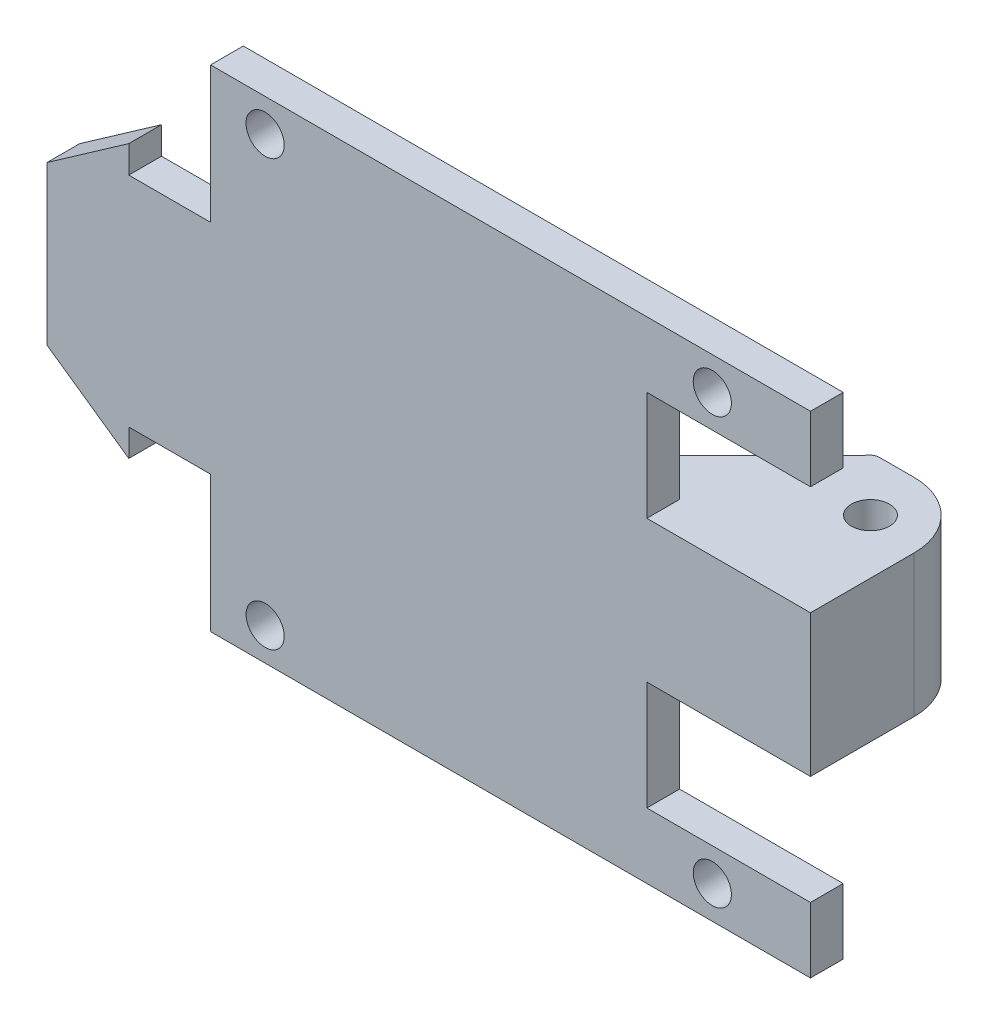
ISO-10303-21;
HEADER;
FILE_DESCRIPTION(('STEP AP214'),'2;1');
FILE_NAME('part.step','',(''),(''),'','','');
FILE_SCHEMA(('AUTOMOTIVE_DESIGN { 1 0 10303 214 1 1 1 1 }'));
ENDSEC;
DATA;
#1=APPLICATION_CONTEXT('core data for automotive mechanical design processes');
#2=APPLICATION_PROTOCOL_DEFINITION('international standard','automotive_design',2000,#1);
#3=PRODUCT_CONTEXT('',#1,'mechanical');
#4=PRODUCT('Part','Part','',(#3));
#5=PRODUCT_RELATED_PRODUCT_CATEGORY('part','',(#4));
#6=PRODUCT_DEFINITION_FORMATION('','',#4);
#7=PRODUCT_DEFINITION_CONTEXT('part definition',#1,'design');
#8=PRODUCT_DEFINITION('design','',#6,#7);
#9=PRODUCT_DEFINITION_SHAPE('','',#8);
#10=(LENGTH_UNIT() NAMED_UNIT(*) SI_UNIT(.MILLI.,.METRE.));
#11=(NAMED_UNIT(*) PLANE_ANGLE_UNIT() SI_UNIT($,.RADIAN.));
#12=(NAMED_UNIT(*) SI_UNIT($,.STERADIAN.) SOLID_ANGLE_UNIT());
#13=UNCERTAINTY_MEASURE_WITH_UNIT(LENGTH_MEASURE(1.E-05),#10,'distance_accuracy_value','');
#14=(GEOMETRIC_REPRESENTATION_CONTEXT(3) GLOBAL_UNCERTAINTY_ASSIGNED_CONTEXT((#13)) GLOBAL_UNIT_ASSIGNED_CONTEXT((#10,
#11,#12)) REPRESENTATION_CONTEXT('',''));
#15=CARTESIAN_POINT('',(0.,0.,0.));
#16=DIRECTION('',(0.,0.,1.));
#17=DIRECTION('',(1.,0.,0.));
#18=AXIS2_PLACEMENT_3D('',#15,#16,#17);
#19=CARTESIAN_POINT('',(-44.4369973190349,19.343163538874,3.));
#20=DIRECTION('',(1.,0.,0.));
#21=DIRECTION('',(0.,1.,0.));
#22=AXIS2_PLACEMENT_3D('',#19,#20,#21);
#23=PLANE('',#22);
#24=DIRECTION('',(0.,0.,-1.));
#25=VECTOR('',#24,1.);
#26=CARTESIAN_POINT('',(-44.4369973190349,6.843163538874,3.));
#27=LINE('',#26,#25);
#28=CARTESIAN_POINT('',(-44.4369973190349,6.843163538874,3.));
#29=VERTEX_POINT('',#28);
#30=CARTESIAN_POINT('',(-44.4369973190349,6.843163538874,0.));
#31=VERTEX_POINT('',#30);
#32=EDGE_CURVE('E217',#29,#31,#27,.T.);
#33=ORIENTED_EDGE('',*,*,#32,.F.);
#34=DIRECTION('',(0.,-1.,0.));
#35=VECTOR('',#34,1.);
#36=CARTESIAN_POINT('',(-44.4369973190349,19.343163538874,3.));
#37=LINE('',#36,#35);
#38=CARTESIAN_POINT('',(-44.4369973190349,19.343163538874,3.));
#39=VERTEX_POINT('',#38);
#40=EDGE_CURVE('E204',#39,#29,#37,.T.);
#41=ORIENTED_EDGE('',*,*,#40,.F.);
#42=DIRECTION('',(0.,0.,-1.));
#43=VECTOR('',#42,1.);
#44=CARTESIAN_POINT('',(-44.4369973190349,19.343163538874,3.));
#45=LINE('',#44,#43);
#46=CARTESIAN_POINT('',(-44.4369973190349,19.343163538874,0.));
#47=VERTEX_POINT('',#46);
#48=EDGE_CURVE('E329',#39,#47,#45,.T.);
#49=ORIENTED_EDGE('',*,*,#48,.T.);
#50=DIRECTION('',(0.,-1.,0.));
#51=VECTOR('',#50,1.);
#52=CARTESIAN_POINT('',(-44.4369973190349,19.343163538874,0.));
#53=LINE('',#52,#51);
#54=EDGE_CURVE('E330',#47,#31,#53,.T.);
#55=ORIENTED_EDGE('',*,*,#54,.T.);
#56=EDGE_LOOP('',(#33,#41,#49,#55));
#57=FACE_BOUND('',#56,.T.);
#58=ADVANCED_FACE('F33',(#57),#23,.F.);
#59=CARTESIAN_POINT('',(10.5630026809652,19.343163538874,3.));
#60=DIRECTION('',(-1.,0.,0.));
#61=DIRECTION('',(0.,-1.,0.));
#62=AXIS2_PLACEMENT_3D('',#59,#60,#61);
#63=PLANE('',#62);
#64=DIRECTION('',(0.,0.,-1.));
#65=VECTOR('',#64,1.);
#66=CARTESIAN_POINT('',(10.5630026809652,-19.656836461126,3.));
#67=LINE('',#66,#65);
#68=CARTESIAN_POINT('',(10.5630026809652,-19.656836461126,3.));
#69=VERTEX_POINT('',#68);
#70=CARTESIAN_POINT('',(10.5630026809652,-19.656836461126,0.));
#71=VERTEX_POINT('',#70);
#72=EDGE_CURVE('E284',#69,#71,#67,.T.);
#73=ORIENTED_EDGE('',*,*,#72,.F.);
#74=DIRECTION('',(0.,1.,0.));
#75=VECTOR('',#74,1.);
#76=CARTESIAN_POINT('',(10.5630026809652,19.343163538874,3.));
#77=LINE('',#76,#75);
#78=CARTESIAN_POINT('',(10.5630026809652,-25.656836461126,3.));
#79=VERTEX_POINT('',#78);
#80=EDGE_CURVE('E324',#79,#69,#77,.T.);
#81=ORIENTED_EDGE('',*,*,#80,.F.);
#82=DIRECTION('',(0.,0.,-1.));
#83=VECTOR('',#82,1.);
#84=CARTESIAN_POINT('',(10.5630026809652,-25.656836461126,3.));
#85=LINE('',#84,#83);
#86=CARTESIAN_POINT('',(10.5630026809652,-25.656836461126,0.));
#87=VERTEX_POINT('',#86);
#88=EDGE_CURVE('E346',#79,#87,#85,.T.);
#89=ORIENTED_EDGE('',*,*,#88,.T.);
#90=DIRECTION('',(0.,1.,0.));
#91=VECTOR('',#90,1.);
#92=CARTESIAN_POINT('',(10.5630026809652,19.343163538874,0.));
#93=LINE('',#92,#91);
#94=EDGE_CURVE('E336',#87,#71,#93,.T.);
#95=ORIENTED_EDGE('',*,*,#94,.T.);
#96=EDGE_LOOP('',(#73,#81,#89,#95));
#97=FACE_BOUND('',#96,.T.);
#98=ADVANCED_FACE('F446',(#97),#63,.F.);
#99=CARTESIAN_POINT('',(10.5630026809652,-9.656836461126,3.));
#100=VERTEX_POINT('',#99);
#101=CARTESIAN_POINT('',(10.5630026809652,3.343163538874,3.));
#102=VERTEX_POINT('',#101);
#103=EDGE_CURVE('E327',#100,#102,#77,.T.);
#104=ORIENTED_EDGE('',*,*,#103,.F.);
#105=DIRECTION('',(0.,0.,1.));
#106=VECTOR('',#105,1.);
#107=CARTESIAN_POINT('',(10.5630026809652,-9.656836461126,-12.5));
#108=LINE('',#107,#106);
#109=CARTESIAN_POINT('',(10.5630026809652,-9.656836461126,-6.5));
#110=VERTEX_POINT('',#109);
#111=EDGE_CURVE('E309',#110,#100,#108,.T.);
#112=ORIENTED_EDGE('',*,*,#111,.F.);
#113=DIRECTION('',(0.,-1.,0.));
#114=VECTOR('',#113,1.);
#115=CARTESIAN_POINT('',(10.5630026809652,3.343163538874,-6.5));
#116=LINE('',#115,#114);
#117=CARTESIAN_POINT('',(10.5630026809652,3.343163538874,-6.5));
#118=VERTEX_POINT('',#117);
#119=EDGE_CURVE('E359',#110,#118,#116,.F.);
#120=ORIENTED_EDGE('',*,*,#119,.T.);
#121=DIRECTION('',(0.,0.,1.));
#122=VECTOR('',#121,1.);
#123=CARTESIAN_POINT('',(10.5630026809652,3.343163538874,-12.5));
#124=LINE('',#123,#122);
#125=EDGE_CURVE('E315',#118,#102,#124,.T.);
#126=ORIENTED_EDGE('',*,*,#125,.T.);
#127=EDGE_LOOP('',(#104,#112,#120,#126));
#128=FACE_BOUND('',#127,.T.);
#129=ADVANCED_FACE('F428',(#128),#63,.F.);
#130=CARTESIAN_POINT('',(0.,0.,0.));
#131=DIRECTION('',(0.,0.,1.));
#132=DIRECTION('',(1.,0.,0.));
#133=AXIS2_PLACEMENT_3D('',#130,#131,#132);
#134=PLANE('',#133);
#135=CARTESIAN_POINT('',(1.56300268096516,-22.656836461126,0.));
#136=DIRECTION('',(0.,0.,-1.));
#137=DIRECTION('',(1.,0.,0.));
#138=AXIS2_PLACEMENT_3D('',#135,#136,#137);
#139=CIRCLE('',#138,1.75);
#140=CARTESIAN_POINT('',(3.31300268096516,-22.656836461126,0.));
#141=VERTEX_POINT('',#140);
#142=EDGE_CURVE('E252',#141,#141,#139,.T.);
#143=ORIENTED_EDGE('',*,*,#142,.F.);
#144=EDGE_LOOP('',(#143));
#145=FACE_BOUND('',#144,.T.);
#146=CARTESIAN_POINT('',(-39.4369973190349,16.343163538874,0.));
#147=DIRECTION('',(0.,0.,-1.));
#148=DIRECTION('',(-1.,0.,0.));
#149=AXIS2_PLACEMENT_3D('',#146,#147,#148);
#150=CIRCLE('',#149,1.75);
#151=CARTESIAN_POINT('',(-41.1869973190349,16.343163538874,0.));
#152=VERTEX_POINT('',#151);
#153=EDGE_CURVE('E269',#152,#152,#150,.T.);
#154=ORIENTED_EDGE('',*,*,#153,.F.);
#155=EDGE_LOOP('',(#154));
#156=FACE_BOUND('',#155,.T.);
#157=CARTESIAN_POINT('',(1.56300268096516,16.343163538874,0.));
#158=DIRECTION('',(0.,0.,-1.));
#159=DIRECTION('',(-1.,0.,0.));
#160=AXIS2_PLACEMENT_3D('',#157,#158,#159);
#161=CIRCLE('',#160,1.75);
#162=CARTESIAN_POINT('',(-0.186997319034844,16.343163538874,0.));
#163=VERTEX_POINT('',#162);
#164=EDGE_CURVE('E265',#163,#163,#161,.T.);
#165=ORIENTED_EDGE('',*,*,#164,.F.);
#166=EDGE_LOOP('',(#165));
#167=FACE_BOUND('',#166,.T.);
#168=CARTESIAN_POINT('',(-39.4369973190349,-22.656836461126,0.));
#169=DIRECTION('',(0.,0.,-1.));
#170=DIRECTION('',(1.,0.,0.));
#171=AXIS2_PLACEMENT_3D('',#168,#169,#170);
#172=CIRCLE('',#171,1.75);
#173=CARTESIAN_POINT('',(-37.6869973190349,-22.656836461126,0.));
#174=VERTEX_POINT('',#173);
#175=EDGE_CURVE('E268',#174,#174,#172,.T.);
#176=ORIENTED_EDGE('',*,*,#175,.F.);
#177=EDGE_LOOP('',(#176));
#178=FACE_BOUND('',#177,.T.);
#179=DIRECTION('',(0.,-1.,0.));
#180=VECTOR('',#179,1.);
#181=CARTESIAN_POINT('',(-4.43699731903485,-9.656836461126,0.));
#182=LINE('',#181,#180);
#183=CARTESIAN_POINT('',(-4.43699731903485,-9.656836461126,0.));
#184=VERTEX_POINT('',#183);
#185=CARTESIAN_POINT('',(-4.43699731903485,-19.656836461126,0.));
#186=VERTEX_POINT('',#185);
#187=EDGE_CURVE('E58',#184,#186,#182,.T.);
#188=ORIENTED_EDGE('',*,*,#187,.T.);
#189=DIRECTION('',(1.,0.,0.));
#190=VECTOR('',#189,1.);
#191=CARTESIAN_POINT('',(-4.43699731903485,-19.656836461126,0.));
#192=LINE('',#191,#190);
#193=EDGE_CURVE('E278',#186,#71,#192,.T.);
#194=ORIENTED_EDGE('',*,*,#193,.T.);
#195=ORIENTED_EDGE('',*,*,#94,.F.);
#196=DIRECTION('',(1.,0.,0.));
#197=VECTOR('',#196,1.);
#198=CARTESIAN_POINT('',(-44.4369973190348,-25.656836461126,0.));
#199=LINE('',#198,#197);
#200=CARTESIAN_POINT('',(-44.4369973190348,-25.656836461126,0.));
#201=VERTEX_POINT('',#200);
#202=EDGE_CURVE('E333',#201,#87,#199,.T.);
#203=ORIENTED_EDGE('',*,*,#202,.F.);
#204=CARTESIAN_POINT('',(-44.4369973190348,-13.156836461126,0.));
#205=VERTEX_POINT('',#204);
#206=EDGE_CURVE('E318',#205,#201,#53,.T.);
#207=ORIENTED_EDGE('',*,*,#206,.F.);
#208=DIRECTION('',(-1.,0.,0.));
#209=VECTOR('',#208,1.);
#210=CARTESIAN_POINT('',(-44.4369973190349,-13.156836461126,0.));
#211=LINE('',#210,#209);
#212=CARTESIAN_POINT('',(-51.9369973190349,-13.156836461126,0.));
#213=VERTEX_POINT('',#212);
#214=EDGE_CURVE('E50',#205,#213,#211,.T.);
#215=ORIENTED_EDGE('',*,*,#214,.T.);
#216=DIRECTION('',(0.,-1.,0.));
#217=VECTOR('',#216,1.);
#218=CARTESIAN_POINT('',(-51.9369973190349,-13.156836461126,0.));
#219=LINE('',#218,#217);
#220=CARTESIAN_POINT('',(-51.9369973190349,-15.656836461126,0.));
#221=VERTEX_POINT('',#220);
#222=EDGE_CURVE('E243',#213,#221,#219,.T.);
#223=ORIENTED_EDGE('',*,*,#222,.T.);
#224=DIRECTION('',(-0.819152044288989,0.57357643635105,0.));
#225=VECTOR('',#224,1.);
#226=CARTESIAN_POINT('',(-51.9369973190349,-15.656836461126,0.));
#227=LINE('',#226,#225);
#228=CARTESIAN_POINT('',(-59.4369973190349,-10.4052799245531,0.));
#229=VERTEX_POINT('',#228);
#230=EDGE_CURVE('E246',#221,#229,#227,.T.);
#231=ORIENTED_EDGE('',*,*,#230,.T.);
#232=DIRECTION('',(0.,-1.,0.));
#233=VECTOR('',#232,1.);
#234=CARTESIAN_POINT('',(-59.4369973190349,4.09160700230121,0.));
#235=LINE('',#234,#233);
#236=CARTESIAN_POINT('',(-59.4369973190349,4.09160700230121,0.));
#237=VERTEX_POINT('',#236);
#238=EDGE_CURVE('E225',#237,#229,#235,.T.);
#239=ORIENTED_EDGE('',*,*,#238,.F.);
#240=DIRECTION('',(-0.819152044288993,-0.573576436351044,0.));
#241=VECTOR('',#240,1.);
#242=CARTESIAN_POINT('',(-51.9369973190349,9.343163538874,0.));
#243=LINE('',#242,#241);
#244=CARTESIAN_POINT('',(-51.9369973190349,9.343163538874,0.));
#245=VERTEX_POINT('',#244);
#246=EDGE_CURVE('E223',#245,#237,#243,.T.);
#247=ORIENTED_EDGE('',*,*,#246,.F.);
#248=DIRECTION('',(0.,-1.,0.));
#249=VECTOR('',#248,1.);
#250=CARTESIAN_POINT('',(-51.9369973190349,9.343163538874,0.));
#251=LINE('',#250,#249);
#252=CARTESIAN_POINT('',(-51.9369973190349,6.843163538874,0.));
#253=VERTEX_POINT('',#252);
#254=EDGE_CURVE('E239',#245,#253,#251,.T.);
#255=ORIENTED_EDGE('',*,*,#254,.T.);
#256=DIRECTION('',(-1.,0.,0.));
#257=VECTOR('',#256,1.);
#258=CARTESIAN_POINT('',(-44.4369973190349,6.843163538874,0.));
#259=LINE('',#258,#257);
#260=EDGE_CURVE('E213',#31,#253,#259,.T.);
#261=ORIENTED_EDGE('',*,*,#260,.F.);
#262=ORIENTED_EDGE('',*,*,#54,.F.);
#263=DIRECTION('',(-1.,0.,0.));
#264=VECTOR('',#263,1.);
#265=CARTESIAN_POINT('',(-44.4369973190349,19.343163538874,0.));
#266=LINE('',#265,#264);
#267=CARTESIAN_POINT('',(10.5630026809652,19.343163538874,0.));
#268=VERTEX_POINT('',#267);
#269=EDGE_CURVE('E339',#268,#47,#266,.T.);
#270=ORIENTED_EDGE('',*,*,#269,.F.);
#271=CARTESIAN_POINT('',(10.5630026809652,13.343163538874,0.));
#272=VERTEX_POINT('',#271);
#273=EDGE_CURVE('E335',#272,#268,#93,.T.);
#274=ORIENTED_EDGE('',*,*,#273,.F.);
#275=DIRECTION('',(1.,0.,0.));
#276=VECTOR('',#275,1.);
#277=CARTESIAN_POINT('',(-4.43699731903485,13.343163538874,0.));
#278=LINE('',#277,#276);
#279=CARTESIAN_POINT('',(-4.43699731903485,13.343163538874,0.));
#280=VERTEX_POINT('',#279);
#281=EDGE_CURVE('E290',#280,#272,#278,.T.);
#282=ORIENTED_EDGE('',*,*,#281,.F.);
#283=DIRECTION('',(0.,1.,0.));
#284=VECTOR('',#283,1.);
#285=CARTESIAN_POINT('',(-4.43699731903484,3.343163538874,0.));
#286=LINE('',#285,#284);
#287=CARTESIAN_POINT('',(-4.43699731903484,3.343163538874,0.));
#288=VERTEX_POINT('',#287);
#289=EDGE_CURVE('E287',#288,#280,#286,.T.);
#290=ORIENTED_EDGE('',*,*,#289,.F.);
#291=DIRECTION('',(1.,0.,0.));
#292=VECTOR('',#291,1.);
#293=CARTESIAN_POINT('',(0.563002680965156,3.343163538874,0.));
#294=LINE('',#293,#292);
#295=CARTESIAN_POINT('',(-11.4369973190348,3.343163538874,0.));
#296=VERTEX_POINT('',#295);
#297=EDGE_CURVE('E310',#296,#288,#294,.T.);
#298=ORIENTED_EDGE('',*,*,#297,.F.);
#299=DIRECTION('',(0.,-1.,0.));
#300=VECTOR('',#299,1.);
#301=CARTESIAN_POINT('',(-11.4369973190348,-9.656836461126,0.));
#302=LINE('',#301,#300);
#303=CARTESIAN_POINT('',(-11.4369973190348,-9.65683646112599,0.));
#304=VERTEX_POINT('',#303);
#305=EDGE_CURVE('E367',#296,#304,#302,.T.);
#306=ORIENTED_EDGE('',*,*,#305,.T.);
#307=DIRECTION('',(-1.,0.,0.));
#308=VECTOR('',#307,1.);
#309=CARTESIAN_POINT('',(0.563002680965156,-9.656836461126,0.));
#310=LINE('',#309,#308);
#311=EDGE_CURVE('E306',#184,#304,#310,.T.);
#312=ORIENTED_EDGE('',*,*,#311,.F.);
#313=EDGE_LOOP('',(#188,#194,#195,#203,#207,#215,#223,#231,#239,#247,#255,#261,#262,#270,#274,
#282,#290,#298,#306,#312));
#314=FACE_BOUND('',#313,.T.);
#315=ADVANCED_FACE('F411',(#145,#156,#167,#178,#314),#134,.F.);
#316=CARTESIAN_POINT('',(0.,0.,3.));
#317=DIRECTION('',(0.,0.,1.));
#318=DIRECTION('',(1.,0.,0.));
#319=AXIS2_PLACEMENT_3D('',#316,#317,#318);
#320=PLANE('',#319);
#321=CARTESIAN_POINT('',(1.56300268096516,-22.656836461126,3.));
#322=DIRECTION('',(0.,0.,1.));
#323=DIRECTION('',(1.,0.,0.));
#324=AXIS2_PLACEMENT_3D('',#321,#322,#323);
#325=CIRCLE('',#324,1.75);
#326=CARTESIAN_POINT('',(3.31300268096516,-22.656836461126,3.));
#327=VERTEX_POINT('',#326);
#328=EDGE_CURVE('E37',#327,#327,#325,.T.);
#329=ORIENTED_EDGE('',*,*,#328,.F.);
#330=EDGE_LOOP('',(#329));
#331=FACE_BOUND('',#330,.T.);
#332=CARTESIAN_POINT('',(-39.4369973190349,16.343163538874,3.));
#333=DIRECTION('',(0.,0.,1.));
#334=DIRECTION('',(1.,0.,0.));
#335=AXIS2_PLACEMENT_3D('',#332,#333,#334);
#336=CIRCLE('',#335,1.75);
#337=CARTESIAN_POINT('',(-37.6869973190349,16.343163538874,3.));
#338=VERTEX_POINT('',#337);
#339=EDGE_CURVE('E398',#338,#338,#336,.T.);
#340=ORIENTED_EDGE('',*,*,#339,.F.);
#341=EDGE_LOOP('',(#340));
#342=FACE_BOUND('',#341,.T.);
#343=CARTESIAN_POINT('',(1.56300268096516,16.343163538874,3.));
#344=DIRECTION('',(0.,0.,1.));
#345=DIRECTION('',(1.,0.,0.));
#346=AXIS2_PLACEMENT_3D('',#343,#344,#345);
#347=CIRCLE('',#346,1.75);
#348=CARTESIAN_POINT('',(3.31300268096516,16.343163538874,3.));
#349=VERTEX_POINT('',#348);
#350=EDGE_CURVE('E396',#349,#349,#347,.T.);
#351=ORIENTED_EDGE('',*,*,#350,.F.);
#352=EDGE_LOOP('',(#351));
#353=FACE_BOUND('',#352,.T.);
#354=CARTESIAN_POINT('',(-39.4369973190349,-22.656836461126,3.));
#355=DIRECTION('',(0.,0.,1.));
#356=DIRECTION('',(1.,0.,0.));
#357=AXIS2_PLACEMENT_3D('',#354,#355,#356);
#358=CIRCLE('',#357,1.75);
#359=CARTESIAN_POINT('',(-37.6869973190349,-22.656836461126,3.));
#360=VERTEX_POINT('',#359);
#361=EDGE_CURVE('E276',#360,#360,#358,.T.);
#362=ORIENTED_EDGE('',*,*,#361,.F.);
#363=EDGE_LOOP('',(#362));
#364=FACE_BOUND('',#363,.T.);
#365=ORIENTED_EDGE('',*,*,#80,.T.);
#366=DIRECTION('',(-1.,0.,0.));
#367=VECTOR('',#366,1.);
#368=CARTESIAN_POINT('',(0.,-19.656836461126,3.));
#369=LINE('',#368,#367);
#370=CARTESIAN_POINT('',(-4.43699731903485,-19.656836461126,3.));
#371=VERTEX_POINT('',#370);
#372=EDGE_CURVE('E11',#69,#371,#369,.T.);
#373=ORIENTED_EDGE('',*,*,#372,.T.);
#374=DIRECTION('',(0.,1.,0.));
#375=VECTOR('',#374,1.);
#376=CARTESIAN_POINT('',(-4.43699731903484,0.,3.));
#377=LINE('',#376,#375);
#378=CARTESIAN_POINT('',(-4.43699731903485,-9.656836461126,3.));
#379=VERTEX_POINT('',#378);
#380=EDGE_CURVE('E42',#371,#379,#377,.T.);
#381=ORIENTED_EDGE('',*,*,#380,.T.);
#382=DIRECTION('',(1.,0.,0.));
#383=VECTOR('',#382,1.);
#384=CARTESIAN_POINT('',(0.,-9.656836461126,3.));
#385=LINE('',#384,#383);
#386=EDGE_CURVE('E389',#379,#100,#385,.T.);
#387=ORIENTED_EDGE('',*,*,#386,.T.);
#388=ORIENTED_EDGE('',*,*,#103,.T.);
#389=DIRECTION('',(1.,0.,0.));
#390=VECTOR('',#389,1.);
#391=CARTESIAN_POINT('',(0.,3.343163538874,3.));
#392=LINE('',#391,#390);
#393=CARTESIAN_POINT('',(-4.43699731903484,3.343163538874,3.));
#394=VERTEX_POINT('',#393);
#395=EDGE_CURVE('E386',#394,#102,#392,.T.);
#396=ORIENTED_EDGE('',*,*,#395,.F.);
#397=DIRECTION('',(0.,-1.,0.));
#398=VECTOR('',#397,1.);
#399=CARTESIAN_POINT('',(-4.43699731903484,0.,3.));
#400=LINE('',#399,#398);
#401=CARTESIAN_POINT('',(-4.43699731903485,13.343163538874,3.));
#402=VERTEX_POINT('',#401);
#403=EDGE_CURVE('E384',#402,#394,#400,.T.);
#404=ORIENTED_EDGE('',*,*,#403,.F.);
#405=DIRECTION('',(-1.,0.,0.));
#406=VECTOR('',#405,1.);
#407=CARTESIAN_POINT('',(0.,13.343163538874,3.));
#408=LINE('',#407,#406);
#409=CARTESIAN_POINT('',(10.5630026809652,13.343163538874,3.));
#410=VERTEX_POINT('',#409);
#411=EDGE_CURVE('E382',#410,#402,#408,.T.);
#412=ORIENTED_EDGE('',*,*,#411,.F.);
#413=CARTESIAN_POINT('',(10.5630026809652,19.343163538874,3.));
#414=VERTEX_POINT('',#413);
#415=EDGE_CURVE('E323',#410,#414,#77,.T.);
#416=ORIENTED_EDGE('',*,*,#415,.T.);
#417=DIRECTION('',(-1.,0.,0.));
#418=VECTOR('',#417,1.);
#419=CARTESIAN_POINT('',(-44.4369973190349,19.343163538874,3.));
#420=LINE('',#419,#418);
#421=EDGE_CURVE('E326',#414,#39,#420,.T.);
#422=ORIENTED_EDGE('',*,*,#421,.T.);
#423=ORIENTED_EDGE('',*,*,#40,.T.);
#424=DIRECTION('',(-1.,0.,0.));
#425=VECTOR('',#424,1.);
#426=CARTESIAN_POINT('',(-44.4369973190349,6.843163538874,3.));
#427=LINE('',#426,#425);
#428=CARTESIAN_POINT('',(-51.9369973190349,6.843163538874,3.));
#429=VERTEX_POINT('',#428);
#430=EDGE_CURVE('E197',#29,#429,#427,.T.);
#431=ORIENTED_EDGE('',*,*,#430,.T.);
#432=DIRECTION('',(0.,-1.,0.));
#433=VECTOR('',#432,1.);
#434=CARTESIAN_POINT('',(-51.9369973190349,9.343163538874,3.));
#435=LINE('',#434,#433);
#436=CARTESIAN_POINT('',(-51.9369973190349,9.343163538874,3.));
#437=VERTEX_POINT('',#436);
#438=EDGE_CURVE('E202',#437,#429,#435,.T.);
#439=ORIENTED_EDGE('',*,*,#438,.F.);
#440=DIRECTION('',(-0.819152044288993,-0.573576436351044,0.));
#441=VECTOR('',#440,1.);
#442=CARTESIAN_POINT('',(-51.9369973190349,9.343163538874,3.));
#443=LINE('',#442,#441);
#444=CARTESIAN_POINT('',(-59.4369973190349,4.09160700230121,3.));
#445=VERTEX_POINT('',#444);
#446=EDGE_CURVE('E218',#437,#445,#443,.T.);
#447=ORIENTED_EDGE('',*,*,#446,.T.);
#448=DIRECTION('',(0.,-1.,0.));
#449=VECTOR('',#448,1.);
#450=CARTESIAN_POINT('',(-59.4369973190349,4.09160700230121,3.));
#451=LINE('',#450,#449);
#452=CARTESIAN_POINT('',(-59.4369973190349,-10.4052799245531,3.));
#453=VERTEX_POINT('',#452);
#454=EDGE_CURVE('E236',#445,#453,#451,.T.);
#455=ORIENTED_EDGE('',*,*,#454,.T.);
#456=DIRECTION('',(-0.819152044288989,0.57357643635105,0.));
#457=VECTOR('',#456,1.);
#458=CARTESIAN_POINT('',(-51.9369973190349,-15.656836461126,3.));
#459=LINE('',#458,#457);
#460=CARTESIAN_POINT('',(-51.9369973190349,-15.656836461126,3.));
#461=VERTEX_POINT('',#460);
#462=EDGE_CURVE('E233',#461,#453,#459,.T.);
#463=ORIENTED_EDGE('',*,*,#462,.F.);
#464=DIRECTION('',(0.,-1.,0.));
#465=VECTOR('',#464,1.);
#466=CARTESIAN_POINT('',(-51.9369973190349,-13.156836461126,3.));
#467=LINE('',#466,#465);
#468=CARTESIAN_POINT('',(-51.9369973190349,-13.156836461126,3.));
#469=VERTEX_POINT('',#468);
#470=EDGE_CURVE('E230',#469,#461,#467,.T.);
#471=ORIENTED_EDGE('',*,*,#470,.F.);
#472=DIRECTION('',(-1.,0.,0.));
#473=VECTOR('',#472,1.);
#474=CARTESIAN_POINT('',(-44.4369973190349,-13.156836461126,3.));
#475=LINE('',#474,#473);
#476=CARTESIAN_POINT('',(-44.4369973190349,-13.156836461126,3.));
#477=VERTEX_POINT('',#476);
#478=EDGE_CURVE('E207',#477,#469,#475,.T.);
#479=ORIENTED_EDGE('',*,*,#478,.F.);
#480=CARTESIAN_POINT('',(-44.4369973190348,-25.656836461126,3.));
#481=VERTEX_POINT('',#480);
#482=EDGE_CURVE('E321',#477,#481,#37,.T.);
#483=ORIENTED_EDGE('',*,*,#482,.T.);
#484=DIRECTION('',(1.,0.,0.));
#485=VECTOR('',#484,1.);
#486=CARTESIAN_POINT('',(-44.4369973190348,-25.656836461126,3.));
#487=LINE('',#486,#485);
#488=EDGE_CURVE('E320',#481,#79,#487,.T.);
#489=ORIENTED_EDGE('',*,*,#488,.T.);
#490=EDGE_LOOP('',(#365,#373,#381,#387,#388,#396,#404,#412,#416,#422,#423,#431,#439,#447,#455,
#463,#471,#479,#483,#489));
#491=FACE_BOUND('',#490,.T.);
#492=ADVANCED_FACE('F200',(#331,#342,#353,#364,#491),#320,.T.);
#493=ORIENTED_EDGE('',*,*,#482,.F.);
#494=DIRECTION('',(0.,0.,-1.));
#495=VECTOR('',#494,1.);
#496=CARTESIAN_POINT('',(-44.4369973190349,-13.156836461126,3.));
#497=LINE('',#496,#495);
#498=EDGE_CURVE('E262',#477,#205,#497,.T.);
#499=ORIENTED_EDGE('',*,*,#498,.T.);
#500=ORIENTED_EDGE('',*,*,#206,.T.);
#501=DIRECTION('',(0.,0.,-1.));
#502=VECTOR('',#501,1.);
#503=CARTESIAN_POINT('',(-44.4369973190348,-25.656836461126,3.));
#504=LINE('',#503,#502);
#505=EDGE_CURVE('E349',#481,#201,#504,.T.);
#506=ORIENTED_EDGE('',*,*,#505,.F.);
#507=EDGE_LOOP('',(#493,#499,#500,#506));
#508=FACE_BOUND('',#507,.T.);
#509=ADVANCED_FACE('F410',(#508),#23,.F.);
#510=CARTESIAN_POINT('',(-44.4369973190348,-25.656836461126,3.));
#511=DIRECTION('',(0.,1.,0.));
#512=DIRECTION('',(0.,0.,1.));
#513=AXIS2_PLACEMENT_3D('',#510,#511,#512);
#514=PLANE('',#513);
#515=ORIENTED_EDGE('',*,*,#202,.T.);
#516=ORIENTED_EDGE('',*,*,#88,.F.);
#517=ORIENTED_EDGE('',*,*,#488,.F.);
#518=ORIENTED_EDGE('',*,*,#505,.T.);
#519=EDGE_LOOP('',(#515,#516,#517,#518));
#520=FACE_BOUND('',#519,.T.);
#521=ADVANCED_FACE('F453',(#520),#514,.F.);
#522=ORIENTED_EDGE('',*,*,#415,.F.);
#523=DIRECTION('',(0.,0.,-1.));
#524=VECTOR('',#523,1.);
#525=CARTESIAN_POINT('',(10.5630026809652,13.343163538874,3.));
#526=LINE('',#525,#524);
#527=EDGE_CURVE('E295',#410,#272,#526,.T.);
#528=ORIENTED_EDGE('',*,*,#527,.T.);
#529=ORIENTED_EDGE('',*,*,#273,.T.);
#530=DIRECTION('',(0.,0.,-1.));
#531=VECTOR('',#530,1.);
#532=CARTESIAN_POINT('',(10.5630026809652,19.343163538874,3.));
#533=LINE('',#532,#531);
#534=EDGE_CURVE('E343',#414,#268,#533,.T.);
#535=ORIENTED_EDGE('',*,*,#534,.F.);
#536=EDGE_LOOP('',(#522,#528,#529,#535));
#537=FACE_BOUND('',#536,.T.);
#538=ADVANCED_FACE('F488',(#537),#63,.F.);
#539=CARTESIAN_POINT('',(-44.4369973190349,19.343163538874,3.));
#540=DIRECTION('',(0.,-1.,0.));
#541=DIRECTION('',(0.,0.,-1.));
#542=AXIS2_PLACEMENT_3D('',#539,#540,#541);
#543=PLANE('',#542);
#544=ORIENTED_EDGE('',*,*,#269,.T.);
#545=ORIENTED_EDGE('',*,*,#48,.F.);
#546=ORIENTED_EDGE('',*,*,#421,.F.);
#547=ORIENTED_EDGE('',*,*,#534,.T.);
#548=EDGE_LOOP('',(#544,#545,#546,#547));
#549=FACE_BOUND('',#548,.T.);
#550=ADVANCED_FACE('F481',(#549),#543,.F.);
#551=CARTESIAN_POINT('',(0.563002680965156,3.343163538874,-12.5));
#552=DIRECTION('',(0.,-1.,0.));
#553=DIRECTION('',(1.,0.,0.));
#554=AXIS2_PLACEMENT_3D('',#551,#552,#553);
#555=PLANE('',#554);
#556=CARTESIAN_POINT('',(5.56300268096516,3.343163538874,-7.5));
#557=DIRECTION('',(0.,1.,0.));
#558=DIRECTION('',(-1.,0.,0.));
#559=AXIS2_PLACEMENT_3D('',#556,#557,#558);
#560=CIRCLE('',#559,1.75);
#561=CARTESIAN_POINT('',(3.81300268096516,3.343163538874,-7.5));
#562=VERTEX_POINT('',#561);
#563=EDGE_CURVE('E299',#562,#562,#560,.T.);
#564=ORIENTED_EDGE('',*,*,#563,.F.);
#565=EDGE_LOOP('',(#564));
#566=FACE_BOUND('',#565,.T.);
#567=DIRECTION('',(1.,0.,0.));
#568=VECTOR('',#567,1.);
#569=CARTESIAN_POINT('',(0.563002680965156,3.343163538874,-12.5));
#570=LINE('',#569,#568);
#571=CARTESIAN_POINT('',(1.42902808474956,3.343163538874,-12.5));
#572=VERTEX_POINT('',#571);
#573=CARTESIAN_POINT('',(4.56300268096516,3.343163538874,-12.5));
#574=VERTEX_POINT('',#573);
#575=EDGE_CURVE('E303',#572,#574,#570,.T.);
#576=ORIENTED_EDGE('',*,*,#575,.F.);
#577=CARTESIAN_POINT('',(1.42902808474956,3.343163538874,-11.5));
#578=DIRECTION('',(0.,-1.,0.));
#579=DIRECTION('',(1.,0.,0.));
#580=AXIS2_PLACEMENT_3D('',#577,#578,#579);
#581=CIRCLE('',#580,1.);
#582=CARTESIAN_POINT('',(0.563002680965156,3.343163538874,-12.0000000000001));
#583=VERTEX_POINT('',#582);
#584=EDGE_CURVE('E378',#572,#583,#581,.F.);
#585=ORIENTED_EDGE('',*,*,#584,.T.);
#586=DIRECTION('',(0.707106781186544,0.,-0.707106781186551));
#587=VECTOR('',#586,1.);
#588=CARTESIAN_POINT('',(0.813002680965123,3.343163538874,-12.25));
#589=LINE('',#588,#587);
#590=EDGE_CURVE('E370',#583,#296,#589,.F.);
#591=ORIENTED_EDGE('',*,*,#590,.T.);
#592=ORIENTED_EDGE('',*,*,#297,.T.);
#593=DIRECTION('',(0.,0.,-1.));
#594=VECTOR('',#593,1.);
#595=CARTESIAN_POINT('',(-4.43699731903484,3.343163538874,5.));
#596=LINE('',#595,#594);
#597=EDGE_CURVE('E293',#394,#288,#596,.T.);
#598=ORIENTED_EDGE('',*,*,#597,.F.);
#599=ORIENTED_EDGE('',*,*,#395,.T.);
#600=ORIENTED_EDGE('',*,*,#125,.F.);
#601=CARTESIAN_POINT('',(4.56300268096516,3.343163538874,-6.5));
#602=DIRECTION('',(0.,-1.,0.));
#603=DIRECTION('',(1.,0.,0.));
#604=AXIS2_PLACEMENT_3D('',#601,#602,#603);
#605=CIRCLE('',#604,6.);
#606=EDGE_CURVE('E361',#118,#574,#605,.F.);
#607=ORIENTED_EDGE('',*,*,#606,.T.);
#608=EDGE_LOOP('',(#576,#585,#591,#592,#598,#599,#600,#607));
#609=FACE_BOUND('',#608,.T.);
#610=ADVANCED_FACE('F500',(#566,#609),#555,.F.);
#611=CARTESIAN_POINT('',(0.563002680965156,-9.656836461126,-12.5));
#612=DIRECTION('',(0.,1.,0.));
#613=DIRECTION('',(-1.,0.,0.));
#614=AXIS2_PLACEMENT_3D('',#611,#612,#613);
#615=PLANE('',#614);
#616=CARTESIAN_POINT('',(5.56300268096516,-9.656836461126,-7.5));
#617=DIRECTION('',(0.,1.,0.));
#618=DIRECTION('',(-1.,0.,0.));
#619=AXIS2_PLACEMENT_3D('',#616,#617,#618);
#620=CIRCLE('',#619,1.75);
#621=CARTESIAN_POINT('',(3.81300268096516,-9.656836461126,-7.5));
#622=VERTEX_POINT('',#621);
#623=EDGE_CURVE('E302',#622,#622,#620,.T.);
#624=ORIENTED_EDGE('',*,*,#623,.T.);
#625=EDGE_LOOP('',(#624));
#626=FACE_BOUND('',#625,.T.);
#627=DIRECTION('',(-0.707106781186544,0.,0.707106781186551));
#628=VECTOR('',#627,1.);
#629=CARTESIAN_POINT('',(0.813002680965123,-9.656836461126,-12.25));
#630=LINE('',#629,#628);
#631=CARTESIAN_POINT('',(0.563002680965156,-9.656836461126,-12.0000000000001));
#632=VERTEX_POINT('',#631);
#633=EDGE_CURVE('E373',#304,#632,#630,.F.);
#634=ORIENTED_EDGE('',*,*,#633,.T.);
#635=CARTESIAN_POINT('',(1.42902808474956,-9.656836461126,-11.5));
#636=DIRECTION('',(0.,1.,0.));
#637=DIRECTION('',(-1.,0.,0.));
#638=AXIS2_PLACEMENT_3D('',#635,#636,#637);
#639=CIRCLE('',#638,1.);
#640=CARTESIAN_POINT('',(1.42902808474956,-9.656836461126,-12.5));
#641=VERTEX_POINT('',#640);
#642=EDGE_CURVE('E380',#632,#641,#639,.F.);
#643=ORIENTED_EDGE('',*,*,#642,.T.);
#644=DIRECTION('',(-1.,0.,0.));
#645=VECTOR('',#644,1.);
#646=CARTESIAN_POINT('',(0.563002680965156,-9.656836461126,-12.5));
#647=LINE('',#646,#645);
#648=CARTESIAN_POINT('',(4.56300268096516,-9.656836461126,-12.5));
#649=VERTEX_POINT('',#648);
#650=EDGE_CURVE('E305',#649,#641,#647,.T.);
#651=ORIENTED_EDGE('',*,*,#650,.F.);
#652=CARTESIAN_POINT('',(4.56300268096516,-9.656836461126,-6.5));
#653=DIRECTION('',(0.,1.,0.));
#654=DIRECTION('',(-1.,0.,0.));
#655=AXIS2_PLACEMENT_3D('',#652,#653,#654);
#656=CIRCLE('',#655,6.);
#657=EDGE_CURVE('E357',#649,#110,#656,.F.);
#658=ORIENTED_EDGE('',*,*,#657,.T.);
#659=ORIENTED_EDGE('',*,*,#111,.T.);
#660=ORIENTED_EDGE('',*,*,#386,.F.);
#661=DIRECTION('',(0.,0.,-1.));
#662=VECTOR('',#661,1.);
#663=CARTESIAN_POINT('',(-4.43699731903485,-9.656836461126,5.));
#664=LINE('',#663,#662);
#665=EDGE_CURVE('E281',#379,#184,#664,.T.);
#666=ORIENTED_EDGE('',*,*,#665,.T.);
#667=ORIENTED_EDGE('',*,*,#311,.T.);
#668=EDGE_LOOP('',(#634,#643,#651,#658,#659,#660,#666,#667));
#669=FACE_BOUND('',#668,.T.);
#670=ADVANCED_FACE('F437',(#626,#669),#615,.F.);
#671=CARTESIAN_POINT('',(0.,0.,-12.5));
#672=DIRECTION('',(0.,0.,-1.));
#673=DIRECTION('',(-1.,0.,0.));
#674=AXIS2_PLACEMENT_3D('',#671,#672,#673);
#675=PLANE('',#674);
#676=ORIENTED_EDGE('',*,*,#650,.T.);
#677=DIRECTION('',(0.,-1.,0.));
#678=VECTOR('',#677,1.);
#679=CARTESIAN_POINT('',(1.42902808474956,3.343163538874,-12.5));
#680=LINE('',#679,#678);
#681=EDGE_CURVE('E375',#641,#572,#680,.F.);
#682=ORIENTED_EDGE('',*,*,#681,.T.);
#683=ORIENTED_EDGE('',*,*,#575,.T.);
#684=DIRECTION('',(0.,-1.,0.));
#685=VECTOR('',#684,1.);
#686=CARTESIAN_POINT('',(4.56300268096516,-9.656836461126,-12.5));
#687=LINE('',#686,#685);
#688=EDGE_CURVE('E352',#574,#649,#687,.T.);
#689=ORIENTED_EDGE('',*,*,#688,.T.);
#690=EDGE_LOOP('',(#676,#682,#683,#689));
#691=FACE_BOUND('',#690,.T.);
#692=ADVANCED_FACE('F510',(#691),#675,.T.);
#693=CARTESIAN_POINT('',(5.56300268096516,-10.156836461126,-7.5));
#694=DIRECTION('',(0.,1.,0.));
#695=DIRECTION('',(-1.,0.,0.));
#696=AXIS2_PLACEMENT_3D('',#693,#694,#695);
#697=CYLINDRICAL_SURFACE('',#696,1.75);
#698=ORIENTED_EDGE('',*,*,#563,.T.);
#699=EDGE_LOOP('',(#698));
#700=FACE_BOUND('',#699,.T.);
#701=ORIENTED_EDGE('',*,*,#623,.F.);
#702=EDGE_LOOP('',(#701));
#703=FACE_BOUND('',#702,.T.);
#704=ADVANCED_FACE('F570',(#700,#703),#697,.F.);
#705=CARTESIAN_POINT('',(4.56300268096516,0.,-6.5));
#706=DIRECTION('',(0.,1.,0.));
#707=DIRECTION('',(-1.,0.,0.));
#708=AXIS2_PLACEMENT_3D('',#705,#706,#707);
#709=CYLINDRICAL_SURFACE('',#708,6.);
#710=ORIENTED_EDGE('',*,*,#606,.F.);
#711=ORIENTED_EDGE('',*,*,#119,.F.);
#712=ORIENTED_EDGE('',*,*,#657,.F.);
#713=ORIENTED_EDGE('',*,*,#688,.F.);
#714=EDGE_LOOP('',(#710,#711,#712,#713));
#715=FACE_BOUND('',#714,.T.);
#716=ADVANCED_FACE('F514',(#715),#709,.T.);
#717=CARTESIAN_POINT('',(0.563002680965156,-9.656836461126,-12.0000000000001));
#718=DIRECTION('',(-0.707106781186551,0.,-0.707106781186544));
#719=DIRECTION('',(0.,-1.,0.));
#720=AXIS2_PLACEMENT_3D('',#717,#718,#719);
#721=PLANE('',#720);
#722=ORIENTED_EDGE('',*,*,#633,.F.);
#723=ORIENTED_EDGE('',*,*,#305,.F.);
#724=ORIENTED_EDGE('',*,*,#590,.F.);
#725=DIRECTION('',(0.,1.,0.));
#726=VECTOR('',#725,1.);
#727=CARTESIAN_POINT('',(0.563002680965156,3.343163538874,-12.0000000000001));
#728=LINE('',#727,#726);
#729=EDGE_CURVE('E364',#632,#583,#728,.T.);
#730=ORIENTED_EDGE('',*,*,#729,.F.);
#731=EDGE_LOOP('',(#722,#723,#724,#730));
#732=FACE_BOUND('',#731,.T.);
#733=ADVANCED_FACE('F504',(#732),#721,.T.);
#734=CARTESIAN_POINT('',(1.42902808474956,-9.656836461126,-11.5));
#735=DIRECTION('',(0.,1.,0.));
#736=DIRECTION('',(0.,0.,1.));
#737=AXIS2_PLACEMENT_3D('',#734,#735,#736);
#738=CYLINDRICAL_SURFACE('',#737,1.);
#739=ORIENTED_EDGE('',*,*,#642,.F.);
#740=ORIENTED_EDGE('',*,*,#729,.T.);
#741=ORIENTED_EDGE('',*,*,#584,.F.);
#742=ORIENTED_EDGE('',*,*,#681,.F.);
#743=EDGE_LOOP('',(#739,#740,#741,#742));
#744=FACE_BOUND('',#743,.T.);
#745=ADVANCED_FACE('F35',(#744),#738,.T.);
#746=CARTESIAN_POINT('',(-4.43699731903485,13.343163538874,5.));
#747=DIRECTION('',(0.,1.,0.));
#748=DIRECTION('',(-1.,0.,0.));
#749=AXIS2_PLACEMENT_3D('',#746,#747,#748);
#750=PLANE('',#749);
#751=ORIENTED_EDGE('',*,*,#411,.T.);
#752=DIRECTION('',(0.,0.,-1.));
#753=VECTOR('',#752,1.);
#754=CARTESIAN_POINT('',(-4.43699731903485,13.343163538874,5.));
#755=LINE('',#754,#753);
#756=EDGE_CURVE('E292',#402,#280,#755,.T.);
#757=ORIENTED_EDGE('',*,*,#756,.T.);
#758=ORIENTED_EDGE('',*,*,#281,.T.);
#759=ORIENTED_EDGE('',*,*,#527,.F.);
#760=EDGE_LOOP('',(#751,#757,#758,#759));
#761=FACE_BOUND('',#760,.T.);
#762=ADVANCED_FACE('F491',(#761),#750,.F.);
#763=CARTESIAN_POINT('',(-4.43699731903484,3.343163538874,5.));
#764=DIRECTION('',(-1.,0.,0.));
#765=DIRECTION('',(0.,-1.,0.));
#766=AXIS2_PLACEMENT_3D('',#763,#764,#765);
#767=PLANE('',#766);
#768=ORIENTED_EDGE('',*,*,#403,.T.);
#769=ORIENTED_EDGE('',*,*,#597,.T.);
#770=ORIENTED_EDGE('',*,*,#289,.T.);
#771=ORIENTED_EDGE('',*,*,#756,.F.);
#772=EDGE_LOOP('',(#768,#769,#770,#771));
#773=FACE_BOUND('',#772,.T.);
#774=ADVANCED_FACE('F497',(#773),#767,.F.);
#775=CARTESIAN_POINT('',(-4.43699731903485,-19.656836461126,5.));
#776=DIRECTION('',(0.,1.,0.));
#777=DIRECTION('',(-1.,0.,0.));
#778=AXIS2_PLACEMENT_3D('',#775,#776,#777);
#779=PLANE('',#778);
#780=ORIENTED_EDGE('',*,*,#72,.T.);
#781=ORIENTED_EDGE('',*,*,#193,.F.);
#782=DIRECTION('',(0.,0.,-1.));
#783=VECTOR('',#782,1.);
#784=CARTESIAN_POINT('',(-4.43699731903485,-19.656836461126,5.));
#785=LINE('',#784,#783);
#786=EDGE_CURVE('E282',#371,#186,#785,.T.);
#787=ORIENTED_EDGE('',*,*,#786,.F.);
#788=ORIENTED_EDGE('',*,*,#372,.F.);
#789=EDGE_LOOP('',(#780,#781,#787,#788));
#790=FACE_BOUND('',#789,.T.);
#791=ADVANCED_FACE('F444',(#790),#779,.T.);
#792=CARTESIAN_POINT('',(-4.43699731903485,-9.656836461126,5.));
#793=DIRECTION('',(1.,0.,0.));
#794=DIRECTION('',(0.,1.,0.));
#795=AXIS2_PLACEMENT_3D('',#792,#793,#794);
#796=PLANE('',#795);
#797=ORIENTED_EDGE('',*,*,#786,.T.);
#798=ORIENTED_EDGE('',*,*,#187,.F.);
#799=ORIENTED_EDGE('',*,*,#665,.F.);
#800=ORIENTED_EDGE('',*,*,#380,.F.);
#801=EDGE_LOOP('',(#797,#798,#799,#800));
#802=FACE_BOUND('',#801,.T.);
#803=ADVANCED_FACE('F422',(#802),#796,.T.);
#804=CARTESIAN_POINT('',(-39.4369973190349,-22.656836461126,5.));
#805=DIRECTION('',(0.,0.,-1.));
#806=DIRECTION('',(-1.,0.,0.));
#807=AXIS2_PLACEMENT_3D('',#804,#805,#806);
#808=CYLINDRICAL_SURFACE('',#807,1.75);
#809=ORIENTED_EDGE('',*,*,#361,.T.);
#810=EDGE_LOOP('',(#809));
#811=FACE_BOUND('',#810,.T.);
#812=ORIENTED_EDGE('',*,*,#175,.T.);
#813=EDGE_LOOP('',(#812));
#814=FACE_BOUND('',#813,.T.);
#815=ADVANCED_FACE('F418',(#811,#814),#808,.F.);
#816=CARTESIAN_POINT('',(1.56300268096516,16.343163538874,5.));
#817=DIRECTION('',(0.,0.,-1.));
#818=DIRECTION('',(-1.,0.,0.));
#819=AXIS2_PLACEMENT_3D('',#816,#817,#818);
#820=CYLINDRICAL_SURFACE('',#819,1.75);
#821=ORIENTED_EDGE('',*,*,#350,.T.);
#822=EDGE_LOOP('',(#821));
#823=FACE_BOUND('',#822,.T.);
#824=ORIENTED_EDGE('',*,*,#164,.T.);
#825=EDGE_LOOP('',(#824));
#826=FACE_BOUND('',#825,.T.);
#827=ADVANCED_FACE('F421',(#823,#826),#820,.F.);
#828=CARTESIAN_POINT('',(-39.4369973190349,16.343163538874,5.));
#829=DIRECTION('',(0.,0.,-1.));
#830=DIRECTION('',(-1.,0.,0.));
#831=AXIS2_PLACEMENT_3D('',#828,#829,#830);
#832=CYLINDRICAL_SURFACE('',#831,1.75);
#833=ORIENTED_EDGE('',*,*,#339,.T.);
#834=EDGE_LOOP('',(#833));
#835=FACE_BOUND('',#834,.T.);
#836=ORIENTED_EDGE('',*,*,#153,.T.);
#837=EDGE_LOOP('',(#836));
#838=FACE_BOUND('',#837,.T.);
#839=ADVANCED_FACE('F624',(#835,#838),#832,.F.);
#840=CARTESIAN_POINT('',(1.56300268096516,-22.656836461126,5.));
#841=DIRECTION('',(0.,0.,-1.));
#842=DIRECTION('',(-1.,0.,0.));
#843=AXIS2_PLACEMENT_3D('',#840,#841,#842);
#844=CYLINDRICAL_SURFACE('',#843,1.75);
#845=ORIENTED_EDGE('',*,*,#328,.T.);
#846=EDGE_LOOP('',(#845));
#847=FACE_BOUND('',#846,.T.);
#848=ORIENTED_EDGE('',*,*,#142,.T.);
#849=EDGE_LOOP('',(#848));
#850=FACE_BOUND('',#849,.T.);
#851=ADVANCED_FACE('F405',(#847,#850),#844,.F.);
#852=CARTESIAN_POINT('',(-51.9369973190349,9.343163538874,3.));
#853=DIRECTION('',(1.,0.,0.));
#854=DIRECTION('',(0.,0.,-1.));
#855=AXIS2_PLACEMENT_3D('',#852,#853,#854);
#856=PLANE('',#855);
#857=ORIENTED_EDGE('',*,*,#254,.F.);
#858=DIRECTION('',(0.,0.,-1.));
#859=VECTOR('',#858,1.);
#860=CARTESIAN_POINT('',(-51.9369973190349,9.343163538874,3.));
#861=LINE('',#860,#859);
#862=EDGE_CURVE('E221',#437,#245,#861,.T.);
#863=ORIENTED_EDGE('',*,*,#862,.F.);
#864=ORIENTED_EDGE('',*,*,#438,.T.);
#865=DIRECTION('',(0.,0.,-1.));
#866=VECTOR('',#865,1.);
#867=CARTESIAN_POINT('',(-51.9369973190349,6.843163538874,3.));
#868=LINE('',#867,#866);
#869=EDGE_CURVE('E210',#429,#253,#868,.T.);
#870=ORIENTED_EDGE('',*,*,#869,.T.);
#871=EDGE_LOOP('',(#857,#863,#864,#870));
#872=FACE_BOUND('',#871,.T.);
#873=ADVANCED_FACE('F220',(#872),#856,.T.);
#874=CARTESIAN_POINT('',(-51.9369973190349,9.343163538874,3.));
#875=DIRECTION('',(0.573576436351044,-0.819152044288993,0.));
#876=DIRECTION('',(0.819152044288994,0.573576436351044,0.));
#877=AXIS2_PLACEMENT_3D('',#874,#875,#876);
#878=PLANE('',#877);
#879=ORIENTED_EDGE('',*,*,#246,.T.);
#880=DIRECTION('',(0.,0.,-1.));
#881=VECTOR('',#880,1.);
#882=CARTESIAN_POINT('',(-59.4369973190349,4.09160700230121,3.));
#883=LINE('',#882,#881);
#884=EDGE_CURVE('E253',#445,#237,#883,.T.);
#885=ORIENTED_EDGE('',*,*,#884,.F.);
#886=ORIENTED_EDGE('',*,*,#446,.F.);
#887=ORIENTED_EDGE('',*,*,#862,.T.);
#888=EDGE_LOOP('',(#879,#885,#886,#887));
#889=FACE_BOUND('',#888,.T.);
#890=ADVANCED_FACE('F474',(#889),#878,.F.);
#891=CARTESIAN_POINT('',(-59.4369973190349,4.09160700230121,3.));
#892=DIRECTION('',(1.,0.,0.));
#893=DIRECTION('',(0.,0.,-1.));
#894=AXIS2_PLACEMENT_3D('',#891,#892,#893);
#895=PLANE('',#894);
#896=ORIENTED_EDGE('',*,*,#238,.T.);
#897=DIRECTION('',(0.,0.,-1.));
#898=VECTOR('',#897,1.);
#899=CARTESIAN_POINT('',(-59.4369973190349,-10.4052799245531,3.));
#900=LINE('',#899,#898);
#901=EDGE_CURVE('E256',#453,#229,#900,.T.);
#902=ORIENTED_EDGE('',*,*,#901,.F.);
#903=ORIENTED_EDGE('',*,*,#454,.F.);
#904=ORIENTED_EDGE('',*,*,#884,.T.);
#905=EDGE_LOOP('',(#896,#902,#903,#904));
#906=FACE_BOUND('',#905,.T.);
#907=ADVANCED_FACE('F471',(#906),#895,.F.);
#908=CARTESIAN_POINT('',(-51.9369973190349,-15.656836461126,3.));
#909=DIRECTION('',(-0.57357643635105,-0.819152044288989,0.));
#910=DIRECTION('',(0.819152044288989,-0.57357643635105,0.));
#911=AXIS2_PLACEMENT_3D('',#908,#909,#910);
#912=PLANE('',#911);
#913=ORIENTED_EDGE('',*,*,#230,.F.);
#914=DIRECTION('',(0.,0.,-1.));
#915=VECTOR('',#914,1.);
#916=CARTESIAN_POINT('',(-51.9369973190349,-15.656836461126,3.));
#917=LINE('',#916,#915);
#918=EDGE_CURVE('E258',#461,#221,#917,.T.);
#919=ORIENTED_EDGE('',*,*,#918,.F.);
#920=ORIENTED_EDGE('',*,*,#462,.T.);
#921=ORIENTED_EDGE('',*,*,#901,.T.);
#922=EDGE_LOOP('',(#913,#919,#920,#921));
#923=FACE_BOUND('',#922,.T.);
#924=ADVANCED_FACE('F467',(#923),#912,.T.);
#925=CARTESIAN_POINT('',(-51.9369973190349,-13.156836461126,3.));
#926=DIRECTION('',(1.,0.,0.));
#927=DIRECTION('',(0.,0.,-1.));
#928=AXIS2_PLACEMENT_3D('',#925,#926,#927);
#929=PLANE('',#928);
#930=ORIENTED_EDGE('',*,*,#222,.F.);
#931=DIRECTION('',(0.,0.,-1.));
#932=VECTOR('',#931,1.);
#933=CARTESIAN_POINT('',(-51.9369973190349,-13.156836461126,3.));
#934=LINE('',#933,#932);
#935=EDGE_CURVE('E260',#469,#213,#934,.T.);
#936=ORIENTED_EDGE('',*,*,#935,.F.);
#937=ORIENTED_EDGE('',*,*,#470,.T.);
#938=ORIENTED_EDGE('',*,*,#918,.T.);
#939=EDGE_LOOP('',(#930,#936,#937,#938));
#940=FACE_BOUND('',#939,.T.);
#941=ADVANCED_FACE('F462',(#940),#929,.T.);
#942=CARTESIAN_POINT('',(-44.4369973190349,-13.156836461126,3.));
#943=DIRECTION('',(0.,-1.,0.));
#944=DIRECTION('',(0.,0.,-1.));
#945=AXIS2_PLACEMENT_3D('',#942,#943,#944);
#946=PLANE('',#945);
#947=ORIENTED_EDGE('',*,*,#214,.F.);
#948=ORIENTED_EDGE('',*,*,#498,.F.);
#949=ORIENTED_EDGE('',*,*,#478,.T.);
#950=ORIENTED_EDGE('',*,*,#935,.T.);
#951=EDGE_LOOP('',(#947,#948,#949,#950));
#952=FACE_BOUND('',#951,.T.);
#953=ADVANCED_FACE('F457',(#952),#946,.T.);
#954=CARTESIAN_POINT('',(-44.4369973190349,6.843163538874,3.));
#955=DIRECTION('',(0.,-1.,0.));
#956=DIRECTION('',(0.,0.,-1.));
#957=AXIS2_PLACEMENT_3D('',#954,#955,#956);
#958=PLANE('',#957);
#959=ORIENTED_EDGE('',*,*,#260,.T.);
#960=ORIENTED_EDGE('',*,*,#869,.F.);
#961=ORIENTED_EDGE('',*,*,#430,.F.);
#962=ORIENTED_EDGE('',*,*,#32,.T.);
#963=EDGE_LOOP('',(#959,#960,#961,#962));
#964=FACE_BOUND('',#963,.T.);
#965=ADVANCED_FACE('F211',(#964),#958,.F.);
#966=CLOSED_SHELL('',(#58,#98,#129,#315,#492,#509,#521,#538,#550,#610,#670,#692,#704,#716,#733,
#745,#762,#774,#791,#803,#815,#827,#839,#851,#873,#890,#907,#924,#941,#953,#965));
#967=MANIFOLD_SOLID_BREP('B2',#966);
#968=ADVANCED_BREP_SHAPE_REPRESENTATION('',(#18,#967),#14);
#969=SHAPE_DEFINITION_REPRESENTATION(#9,#968);
ENDSEC;
END-ISO-10303-21;
